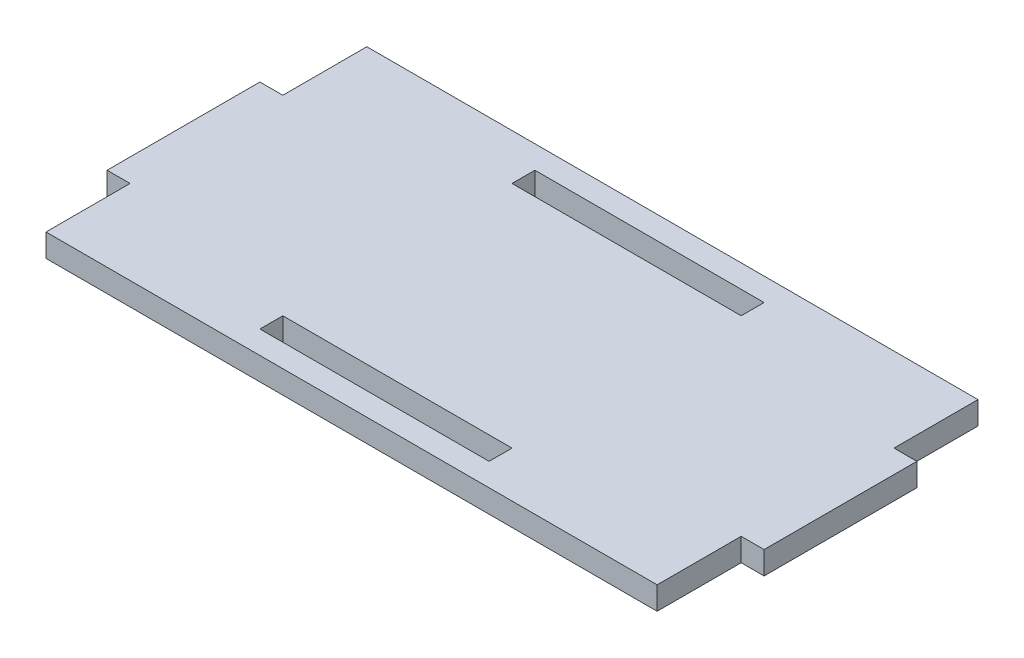
ISO-10303-21;
HEADER;
FILE_DESCRIPTION(('STEP AP214'),'2;1');
FILE_NAME('part.step','',(''),(''),'','','');
FILE_SCHEMA(('AUTOMOTIVE_DESIGN { 1 0 10303 214 1 1 1 1 }'));
ENDSEC;
DATA;
#1=APPLICATION_CONTEXT('core data for automotive mechanical design processes');
#2=APPLICATION_PROTOCOL_DEFINITION('international standard','automotive_design',2000,#1);
#3=PRODUCT_CONTEXT('',#1,'mechanical');
#4=PRODUCT('Part','Part','',(#3));
#5=PRODUCT_RELATED_PRODUCT_CATEGORY('part','',(#4));
#6=PRODUCT_DEFINITION_FORMATION('','',#4);
#7=PRODUCT_DEFINITION_CONTEXT('part definition',#1,'design');
#8=PRODUCT_DEFINITION('design','',#6,#7);
#9=PRODUCT_DEFINITION_SHAPE('','',#8);
#10=(LENGTH_UNIT() NAMED_UNIT(*) SI_UNIT(.MILLI.,.METRE.));
#11=(NAMED_UNIT(*) PLANE_ANGLE_UNIT() SI_UNIT($,.RADIAN.));
#12=(NAMED_UNIT(*) SI_UNIT($,.STERADIAN.) SOLID_ANGLE_UNIT());
#13=UNCERTAINTY_MEASURE_WITH_UNIT(LENGTH_MEASURE(1.E-05),#10,'distance_accuracy_value','');
#14=(GEOMETRIC_REPRESENTATION_CONTEXT(3) GLOBAL_UNCERTAINTY_ASSIGNED_CONTEXT((#13)) GLOBAL_UNIT_ASSIGNED_CONTEXT((#10,
#11,#12)) REPRESENTATION_CONTEXT('',''));
#15=CARTESIAN_POINT('',(0.,0.,0.));
#16=DIRECTION('',(0.,0.,1.));
#17=DIRECTION('',(1.,0.,0.));
#18=AXIS2_PLACEMENT_3D('',#15,#16,#17);
#19=CARTESIAN_POINT('',(0.,3.,0.));
#20=DIRECTION('',(0.,1.,0.));
#21=DIRECTION('',(0.,0.,1.));
#22=AXIS2_PLACEMENT_3D('',#19,#20,#21);
#23=PLANE('',#22);
#24=DIRECTION('',(0.,0.,1.));
#25=VECTOR('',#24,1.);
#26=CARTESIAN_POINT('',(0.,3.,0.));
#27=LINE('',#26,#25);
#28=CARTESIAN_POINT('',(0.,3.,-11.));
#29=VERTEX_POINT('',#28);
#30=CARTESIAN_POINT('',(0.,3.,0.));
#31=VERTEX_POINT('',#30);
#32=EDGE_CURVE('E237',#29,#31,#27,.T.);
#33=ORIENTED_EDGE('',*,*,#32,.T.);
#34=DIRECTION('',(1.,0.,0.));
#35=VECTOR('',#34,1.);
#36=CARTESIAN_POINT('',(0.,3.,0.));
#37=LINE('',#36,#35);
#38=CARTESIAN_POINT('',(80.,3.,0.));
#39=VERTEX_POINT('',#38);
#40=EDGE_CURVE('E240',#31,#39,#37,.T.);
#41=ORIENTED_EDGE('',*,*,#40,.T.);
#42=DIRECTION('',(0.,0.,-1.));
#43=VECTOR('',#42,1.);
#44=CARTESIAN_POINT('',(80.,3.,0.));
#45=LINE('',#44,#43);
#46=CARTESIAN_POINT('',(80.,3.,-11.));
#47=VERTEX_POINT('',#46);
#48=EDGE_CURVE('E243',#39,#47,#45,.T.);
#49=ORIENTED_EDGE('',*,*,#48,.T.);
#50=DIRECTION('',(1.,0.,0.));
#51=VECTOR('',#50,1.);
#52=CARTESIAN_POINT('',(80.,3.,-11.));
#53=LINE('',#52,#51);
#54=CARTESIAN_POINT('',(83.,3.,-11.));
#55=VERTEX_POINT('',#54);
#56=EDGE_CURVE('E245',#47,#55,#53,.T.);
#57=ORIENTED_EDGE('',*,*,#56,.T.);
#58=DIRECTION('',(0.,0.,-1.));
#59=VECTOR('',#58,1.);
#60=CARTESIAN_POINT('',(83.,3.,-31.));
#61=LINE('',#60,#59);
#62=CARTESIAN_POINT('',(83.,3.,-31.));
#63=VERTEX_POINT('',#62);
#64=EDGE_CURVE('E247',#55,#63,#61,.T.);
#65=ORIENTED_EDGE('',*,*,#64,.T.);
#66=DIRECTION('',(-1.,0.,0.));
#67=VECTOR('',#66,1.);
#68=CARTESIAN_POINT('',(80.,3.,-31.));
#69=LINE('',#68,#67);
#70=CARTESIAN_POINT('',(80.,3.,-31.));
#71=VERTEX_POINT('',#70);
#72=EDGE_CURVE('E249',#63,#71,#69,.T.);
#73=ORIENTED_EDGE('',*,*,#72,.T.);
#74=DIRECTION('',(0.,0.,-1.));
#75=VECTOR('',#74,1.);
#76=CARTESIAN_POINT('',(80.,3.,-31.));
#77=LINE('',#76,#75);
#78=CARTESIAN_POINT('',(80.,3.,-42.));
#79=VERTEX_POINT('',#78);
#80=EDGE_CURVE('E251',#71,#79,#77,.T.);
#81=ORIENTED_EDGE('',*,*,#80,.T.);
#82=DIRECTION('',(-1.,0.,0.));
#83=VECTOR('',#82,1.);
#84=CARTESIAN_POINT('',(0.,3.,-42.));
#85=LINE('',#84,#83);
#86=CARTESIAN_POINT('',(0.,3.,-42.));
#87=VERTEX_POINT('',#86);
#88=EDGE_CURVE('E253',#79,#87,#85,.T.);
#89=ORIENTED_EDGE('',*,*,#88,.T.);
#90=DIRECTION('',(0.,0.,1.));
#91=VECTOR('',#90,1.);
#92=CARTESIAN_POINT('',(0.,3.,-31.));
#93=LINE('',#92,#91);
#94=CARTESIAN_POINT('',(0.,3.,-31.));
#95=VERTEX_POINT('',#94);
#96=EDGE_CURVE('E255',#87,#95,#93,.T.);
#97=ORIENTED_EDGE('',*,*,#96,.T.);
#98=DIRECTION('',(-1.,0.,0.));
#99=VECTOR('',#98,1.);
#100=CARTESIAN_POINT('',(0.,3.,-31.));
#101=LINE('',#100,#99);
#102=CARTESIAN_POINT('',(-3.,3.,-31.));
#103=VERTEX_POINT('',#102);
#104=EDGE_CURVE('E257',#95,#103,#101,.T.);
#105=ORIENTED_EDGE('',*,*,#104,.T.);
#106=DIRECTION('',(0.,0.,1.));
#107=VECTOR('',#106,1.);
#108=CARTESIAN_POINT('',(-3.,3.,-31.));
#109=LINE('',#108,#107);
#110=CARTESIAN_POINT('',(-3.,3.,-11.));
#111=VERTEX_POINT('',#110);
#112=EDGE_CURVE('E259',#103,#111,#109,.T.);
#113=ORIENTED_EDGE('',*,*,#112,.T.);
#114=DIRECTION('',(1.,0.,0.));
#115=VECTOR('',#114,1.);
#116=CARTESIAN_POINT('',(0.,3.,-11.));
#117=LINE('',#116,#115);
#118=EDGE_CURVE('E261',#111,#29,#117,.T.);
#119=ORIENTED_EDGE('',*,*,#118,.T.);
#120=EDGE_LOOP('',(#33,#41,#49,#57,#65,#73,#81,#89,#97,#105,#113,#119));
#121=FACE_BOUND('',#120,.T.);
#122=DIRECTION('',(1.,0.,0.));
#123=VECTOR('',#122,1.);
#124=CARTESIAN_POINT('',(25.,3.,-36.));
#125=LINE('',#124,#123);
#126=CARTESIAN_POINT('',(25.,3.,-36.));
#127=VERTEX_POINT('',#126);
#128=CARTESIAN_POINT('',(55.,3.,-36.));
#129=VERTEX_POINT('',#128);
#130=EDGE_CURVE('E208',#127,#129,#125,.T.);
#131=ORIENTED_EDGE('',*,*,#130,.F.);
#132=DIRECTION('',(0.,0.,1.));
#133=VECTOR('',#132,1.);
#134=CARTESIAN_POINT('',(25.,3.,-39.));
#135=LINE('',#134,#133);
#136=CARTESIAN_POINT('',(25.,3.,-39.));
#137=VERTEX_POINT('',#136);
#138=EDGE_CURVE('E206',#137,#127,#135,.T.);
#139=ORIENTED_EDGE('',*,*,#138,.F.);
#140=DIRECTION('',(-1.,0.,0.));
#141=VECTOR('',#140,1.);
#142=CARTESIAN_POINT('',(25.,3.,-39.));
#143=LINE('',#142,#141);
#144=CARTESIAN_POINT('',(55.,3.,-39.));
#145=VERTEX_POINT('',#144);
#146=EDGE_CURVE('E214',#145,#137,#143,.T.);
#147=ORIENTED_EDGE('',*,*,#146,.F.);
#148=DIRECTION('',(0.,0.,-1.));
#149=VECTOR('',#148,1.);
#150=CARTESIAN_POINT('',(55.,3.,-39.));
#151=LINE('',#150,#149);
#152=EDGE_CURVE('E211',#129,#145,#151,.T.);
#153=ORIENTED_EDGE('',*,*,#152,.F.);
#154=EDGE_LOOP('',(#131,#139,#147,#153));
#155=FACE_BOUND('',#154,.T.);
#156=DIRECTION('',(1.,0.,0.));
#157=VECTOR('',#156,1.);
#158=CARTESIAN_POINT('',(25.,3.,-3.));
#159=LINE('',#158,#157);
#160=CARTESIAN_POINT('',(25.,3.,-3.));
#161=VERTEX_POINT('',#160);
#162=CARTESIAN_POINT('',(55.,3.,-3.));
#163=VERTEX_POINT('',#162);
#164=EDGE_CURVE('E178',#161,#163,#159,.T.);
#165=ORIENTED_EDGE('',*,*,#164,.F.);
#166=DIRECTION('',(0.,0.,1.));
#167=VECTOR('',#166,1.);
#168=CARTESIAN_POINT('',(25.,3.,-3.));
#169=LINE('',#168,#167);
#170=CARTESIAN_POINT('',(25.,3.,-6.));
#171=VERTEX_POINT('',#170);
#172=EDGE_CURVE('E170',#171,#161,#169,.T.);
#173=ORIENTED_EDGE('',*,*,#172,.F.);
#174=DIRECTION('',(-1.,0.,0.));
#175=VECTOR('',#174,1.);
#176=CARTESIAN_POINT('',(25.,3.,-6.));
#177=LINE('',#176,#175);
#178=CARTESIAN_POINT('',(55.,3.,-6.));
#179=VERTEX_POINT('',#178);
#180=EDGE_CURVE('E192',#179,#171,#177,.T.);
#181=ORIENTED_EDGE('',*,*,#180,.F.);
#182=DIRECTION('',(0.,0.,-1.));
#183=VECTOR('',#182,1.);
#184=CARTESIAN_POINT('',(55.,3.,-3.));
#185=LINE('',#184,#183);
#186=EDGE_CURVE('E190',#163,#179,#185,.T.);
#187=ORIENTED_EDGE('',*,*,#186,.F.);
#188=EDGE_LOOP('',(#165,#173,#181,#187));
#189=FACE_BOUND('',#188,.T.);
#190=ADVANCED_FACE('F33',(#121,#155,#189),#23,.T.);
#191=CARTESIAN_POINT('',(0.,0.,0.));
#192=DIRECTION('',(0.,1.,0.));
#193=DIRECTION('',(0.,0.,1.));
#194=AXIS2_PLACEMENT_3D('',#191,#192,#193);
#195=PLANE('',#194);
#196=DIRECTION('',(0.,0.,1.));
#197=VECTOR('',#196,1.);
#198=CARTESIAN_POINT('',(25.,0.,-39.));
#199=LINE('',#198,#197);
#200=CARTESIAN_POINT('',(25.,0.,-39.));
#201=VERTEX_POINT('',#200);
#202=CARTESIAN_POINT('',(25.,0.,-36.));
#203=VERTEX_POINT('',#202);
#204=EDGE_CURVE('E186',#201,#203,#199,.T.);
#205=ORIENTED_EDGE('',*,*,#204,.T.);
#206=DIRECTION('',(1.,0.,0.));
#207=VECTOR('',#206,1.);
#208=CARTESIAN_POINT('',(25.,0.,-36.));
#209=LINE('',#208,#207);
#210=CARTESIAN_POINT('',(55.,0.,-36.));
#211=VERTEX_POINT('',#210);
#212=EDGE_CURVE('E219',#203,#211,#209,.T.);
#213=ORIENTED_EDGE('',*,*,#212,.T.);
#214=DIRECTION('',(0.,0.,-1.));
#215=VECTOR('',#214,1.);
#216=CARTESIAN_POINT('',(55.,0.,-39.));
#217=LINE('',#216,#215);
#218=CARTESIAN_POINT('',(55.,0.,-39.));
#219=VERTEX_POINT('',#218);
#220=EDGE_CURVE('E222',#211,#219,#217,.T.);
#221=ORIENTED_EDGE('',*,*,#220,.T.);
#222=DIRECTION('',(-1.,0.,0.));
#223=VECTOR('',#222,1.);
#224=CARTESIAN_POINT('',(25.,0.,-39.));
#225=LINE('',#224,#223);
#226=EDGE_CURVE('E209',#219,#201,#225,.T.);
#227=ORIENTED_EDGE('',*,*,#226,.T.);
#228=EDGE_LOOP('',(#205,#213,#221,#227));
#229=FACE_BOUND('',#228,.T.);
#230=DIRECTION('',(0.,0.,1.));
#231=VECTOR('',#230,1.);
#232=CARTESIAN_POINT('',(0.,0.,0.));
#233=LINE('',#232,#231);
#234=CARTESIAN_POINT('',(0.,0.,-11.));
#235=VERTEX_POINT('',#234);
#236=CARTESIAN_POINT('',(0.,0.,0.));
#237=VERTEX_POINT('',#236);
#238=EDGE_CURVE('E236',#235,#237,#233,.T.);
#239=ORIENTED_EDGE('',*,*,#238,.F.);
#240=DIRECTION('',(1.,0.,0.));
#241=VECTOR('',#240,1.);
#242=CARTESIAN_POINT('',(0.,0.,-11.));
#243=LINE('',#242,#241);
#244=CARTESIAN_POINT('',(-3.,0.,-11.));
#245=VERTEX_POINT('',#244);
#246=EDGE_CURVE('E241',#245,#235,#243,.T.);
#247=ORIENTED_EDGE('',*,*,#246,.F.);
#248=DIRECTION('',(0.,0.,1.));
#249=VECTOR('',#248,1.);
#250=CARTESIAN_POINT('',(-3.,0.,-31.));
#251=LINE('',#250,#249);
#252=CARTESIAN_POINT('',(-3.,0.,-31.));
#253=VERTEX_POINT('',#252);
#254=EDGE_CURVE('E284',#253,#245,#251,.T.);
#255=ORIENTED_EDGE('',*,*,#254,.F.);
#256=DIRECTION('',(-1.,0.,0.));
#257=VECTOR('',#256,1.);
#258=CARTESIAN_POINT('',(0.,0.,-31.));
#259=LINE('',#258,#257);
#260=CARTESIAN_POINT('',(0.,0.,-31.));
#261=VERTEX_POINT('',#260);
#262=EDGE_CURVE('E282',#261,#253,#259,.T.);
#263=ORIENTED_EDGE('',*,*,#262,.F.);
#264=DIRECTION('',(0.,0.,1.));
#265=VECTOR('',#264,1.);
#266=CARTESIAN_POINT('',(0.,0.,-31.));
#267=LINE('',#266,#265);
#268=CARTESIAN_POINT('',(0.,0.,-42.));
#269=VERTEX_POINT('',#268);
#270=EDGE_CURVE('E280',#269,#261,#267,.T.);
#271=ORIENTED_EDGE('',*,*,#270,.F.);
#272=DIRECTION('',(-1.,0.,0.));
#273=VECTOR('',#272,1.);
#274=CARTESIAN_POINT('',(0.,0.,-42.));
#275=LINE('',#274,#273);
#276=CARTESIAN_POINT('',(80.,0.,-42.));
#277=VERTEX_POINT('',#276);
#278=EDGE_CURVE('E278',#277,#269,#275,.T.);
#279=ORIENTED_EDGE('',*,*,#278,.F.);
#280=DIRECTION('',(0.,0.,-1.));
#281=VECTOR('',#280,1.);
#282=CARTESIAN_POINT('',(80.,0.,-31.));
#283=LINE('',#282,#281);
#284=CARTESIAN_POINT('',(80.,0.,-31.));
#285=VERTEX_POINT('',#284);
#286=EDGE_CURVE('E276',#285,#277,#283,.T.);
#287=ORIENTED_EDGE('',*,*,#286,.F.);
#288=DIRECTION('',(-1.,0.,0.));
#289=VECTOR('',#288,1.);
#290=CARTESIAN_POINT('',(80.,0.,-31.));
#291=LINE('',#290,#289);
#292=CARTESIAN_POINT('',(83.,0.,-31.));
#293=VERTEX_POINT('',#292);
#294=EDGE_CURVE('E274',#293,#285,#291,.T.);
#295=ORIENTED_EDGE('',*,*,#294,.F.);
#296=DIRECTION('',(0.,0.,-1.));
#297=VECTOR('',#296,1.);
#298=CARTESIAN_POINT('',(83.,0.,-31.));
#299=LINE('',#298,#297);
#300=CARTESIAN_POINT('',(83.,0.,-11.));
#301=VERTEX_POINT('',#300);
#302=EDGE_CURVE('E272',#301,#293,#299,.T.);
#303=ORIENTED_EDGE('',*,*,#302,.F.);
#304=DIRECTION('',(1.,0.,0.));
#305=VECTOR('',#304,1.);
#306=CARTESIAN_POINT('',(80.,0.,-11.));
#307=LINE('',#306,#305);
#308=CARTESIAN_POINT('',(80.,0.,-11.));
#309=VERTEX_POINT('',#308);
#310=EDGE_CURVE('E270',#309,#301,#307,.T.);
#311=ORIENTED_EDGE('',*,*,#310,.F.);
#312=DIRECTION('',(0.,0.,-1.));
#313=VECTOR('',#312,1.);
#314=CARTESIAN_POINT('',(80.,0.,0.));
#315=LINE('',#314,#313);
#316=CARTESIAN_POINT('',(80.,0.,0.));
#317=VERTEX_POINT('',#316);
#318=EDGE_CURVE('E268',#317,#309,#315,.T.);
#319=ORIENTED_EDGE('',*,*,#318,.F.);
#320=DIRECTION('',(1.,0.,0.));
#321=VECTOR('',#320,1.);
#322=CARTESIAN_POINT('',(0.,0.,0.));
#323=LINE('',#322,#321);
#324=EDGE_CURVE('E266',#237,#317,#323,.T.);
#325=ORIENTED_EDGE('',*,*,#324,.F.);
#326=EDGE_LOOP('',(#239,#247,#255,#263,#271,#279,#287,#295,#303,#311,#319,#325));
#327=FACE_BOUND('',#326,.T.);
#328=DIRECTION('',(0.,0.,1.));
#329=VECTOR('',#328,1.);
#330=CARTESIAN_POINT('',(25.,0.,-3.));
#331=LINE('',#330,#329);
#332=CARTESIAN_POINT('',(25.,0.,-6.));
#333=VERTEX_POINT('',#332);
#334=CARTESIAN_POINT('',(25.,0.,-3.));
#335=VERTEX_POINT('',#334);
#336=EDGE_CURVE('E56',#333,#335,#331,.T.);
#337=ORIENTED_EDGE('',*,*,#336,.T.);
#338=DIRECTION('',(1.,0.,0.));
#339=VECTOR('',#338,1.);
#340=CARTESIAN_POINT('',(25.,0.,-3.));
#341=LINE('',#340,#339);
#342=CARTESIAN_POINT('',(55.,0.,-3.));
#343=VERTEX_POINT('',#342);
#344=EDGE_CURVE('E185',#335,#343,#341,.T.);
#345=ORIENTED_EDGE('',*,*,#344,.T.);
#346=DIRECTION('',(0.,0.,-1.));
#347=VECTOR('',#346,1.);
#348=CARTESIAN_POINT('',(55.,0.,-3.));
#349=LINE('',#348,#347);
#350=CARTESIAN_POINT('',(55.,0.,-6.));
#351=VERTEX_POINT('',#350);
#352=EDGE_CURVE('E198',#343,#351,#349,.T.);
#353=ORIENTED_EDGE('',*,*,#352,.T.);
#354=DIRECTION('',(-1.,0.,0.));
#355=VECTOR('',#354,1.);
#356=CARTESIAN_POINT('',(25.,0.,-6.));
#357=LINE('',#356,#355);
#358=EDGE_CURVE('E179',#351,#333,#357,.T.);
#359=ORIENTED_EDGE('',*,*,#358,.T.);
#360=EDGE_LOOP('',(#337,#345,#353,#359));
#361=FACE_BOUND('',#360,.T.);
#362=ADVANCED_FACE('F326',(#229,#327,#361),#195,.F.);
#363=CARTESIAN_POINT('',(0.,3.,0.));
#364=DIRECTION('',(1.,0.,0.));
#365=DIRECTION('',(0.,0.,-1.));
#366=AXIS2_PLACEMENT_3D('',#363,#364,#365);
#367=PLANE('',#366);
#368=ORIENTED_EDGE('',*,*,#238,.T.);
#369=DIRECTION('',(0.,-1.,0.));
#370=VECTOR('',#369,1.);
#371=CARTESIAN_POINT('',(0.,3.,0.));
#372=LINE('',#371,#370);
#373=EDGE_CURVE('E11',#31,#237,#372,.T.);
#374=ORIENTED_EDGE('',*,*,#373,.F.);
#375=ORIENTED_EDGE('',*,*,#32,.F.);
#376=DIRECTION('',(0.,-1.,0.));
#377=VECTOR('',#376,1.);
#378=CARTESIAN_POINT('',(0.,3.,-11.));
#379=LINE('',#378,#377);
#380=EDGE_CURVE('E263',#29,#235,#379,.T.);
#381=ORIENTED_EDGE('',*,*,#380,.T.);
#382=EDGE_LOOP('',(#368,#374,#375,#381));
#383=FACE_BOUND('',#382,.T.);
#384=ADVANCED_FACE('F35',(#383),#367,.F.);
#385=CARTESIAN_POINT('',(0.,3.,0.));
#386=DIRECTION('',(0.,0.,-1.));
#387=DIRECTION('',(-1.,0.,0.));
#388=AXIS2_PLACEMENT_3D('',#385,#386,#387);
#389=PLANE('',#388);
#390=ORIENTED_EDGE('',*,*,#324,.T.);
#391=DIRECTION('',(0.,-1.,0.));
#392=VECTOR('',#391,1.);
#393=CARTESIAN_POINT('',(80.,3.,0.));
#394=LINE('',#393,#392);
#395=EDGE_CURVE('E41',#39,#317,#394,.T.);
#396=ORIENTED_EDGE('',*,*,#395,.F.);
#397=ORIENTED_EDGE('',*,*,#40,.F.);
#398=ORIENTED_EDGE('',*,*,#373,.T.);
#399=EDGE_LOOP('',(#390,#396,#397,#398));
#400=FACE_BOUND('',#399,.T.);
#401=ADVANCED_FACE('F344',(#400),#389,.F.);
#402=CARTESIAN_POINT('',(80.,3.,0.));
#403=DIRECTION('',(-1.,0.,0.));
#404=DIRECTION('',(0.,0.,1.));
#405=AXIS2_PLACEMENT_3D('',#402,#403,#404);
#406=PLANE('',#405);
#407=ORIENTED_EDGE('',*,*,#318,.T.);
#408=DIRECTION('',(0.,-1.,0.));
#409=VECTOR('',#408,1.);
#410=CARTESIAN_POINT('',(80.,3.,-11.));
#411=LINE('',#410,#409);
#412=EDGE_CURVE('E313',#47,#309,#411,.T.);
#413=ORIENTED_EDGE('',*,*,#412,.F.);
#414=ORIENTED_EDGE('',*,*,#48,.F.);
#415=ORIENTED_EDGE('',*,*,#395,.T.);
#416=EDGE_LOOP('',(#407,#413,#414,#415));
#417=FACE_BOUND('',#416,.T.);
#418=ADVANCED_FACE('F320',(#417),#406,.F.);
#419=CARTESIAN_POINT('',(80.,3.,-11.));
#420=DIRECTION('',(0.,0.,-1.));
#421=DIRECTION('',(-1.,0.,0.));
#422=AXIS2_PLACEMENT_3D('',#419,#420,#421);
#423=PLANE('',#422);
#424=ORIENTED_EDGE('',*,*,#310,.T.);
#425=DIRECTION('',(0.,-1.,0.));
#426=VECTOR('',#425,1.);
#427=CARTESIAN_POINT('',(83.,3.,-11.));
#428=LINE('',#427,#426);
#429=EDGE_CURVE('E310',#55,#301,#428,.T.);
#430=ORIENTED_EDGE('',*,*,#429,.F.);
#431=ORIENTED_EDGE('',*,*,#56,.F.);
#432=ORIENTED_EDGE('',*,*,#412,.T.);
#433=EDGE_LOOP('',(#424,#430,#431,#432));
#434=FACE_BOUND('',#433,.T.);
#435=ADVANCED_FACE('F332',(#434),#423,.F.);
#436=CARTESIAN_POINT('',(83.,3.,-31.));
#437=DIRECTION('',(-1.,0.,0.));
#438=DIRECTION('',(0.,0.,1.));
#439=AXIS2_PLACEMENT_3D('',#436,#437,#438);
#440=PLANE('',#439);
#441=ORIENTED_EDGE('',*,*,#302,.T.);
#442=DIRECTION('',(0.,-1.,0.));
#443=VECTOR('',#442,1.);
#444=CARTESIAN_POINT('',(83.,3.,-31.));
#445=LINE('',#444,#443);
#446=EDGE_CURVE('E307',#63,#293,#445,.T.);
#447=ORIENTED_EDGE('',*,*,#446,.F.);
#448=ORIENTED_EDGE('',*,*,#64,.F.);
#449=ORIENTED_EDGE('',*,*,#429,.T.);
#450=EDGE_LOOP('',(#441,#447,#448,#449));
#451=FACE_BOUND('',#450,.T.);
#452=ADVANCED_FACE('F336',(#451),#440,.F.);
#453=CARTESIAN_POINT('',(80.,3.,-31.));
#454=DIRECTION('',(0.,0.,1.));
#455=DIRECTION('',(1.,0.,0.));
#456=AXIS2_PLACEMENT_3D('',#453,#454,#455);
#457=PLANE('',#456);
#458=ORIENTED_EDGE('',*,*,#294,.T.);
#459=DIRECTION('',(0.,-1.,0.));
#460=VECTOR('',#459,1.);
#461=CARTESIAN_POINT('',(80.,3.,-31.));
#462=LINE('',#461,#460);
#463=EDGE_CURVE('E304',#71,#285,#462,.T.);
#464=ORIENTED_EDGE('',*,*,#463,.F.);
#465=ORIENTED_EDGE('',*,*,#72,.F.);
#466=ORIENTED_EDGE('',*,*,#446,.T.);
#467=EDGE_LOOP('',(#458,#464,#465,#466));
#468=FACE_BOUND('',#467,.T.);
#469=ADVANCED_FACE('F377',(#468),#457,.F.);
#470=CARTESIAN_POINT('',(80.,3.,-31.));
#471=DIRECTION('',(-1.,0.,0.));
#472=DIRECTION('',(0.,0.,1.));
#473=AXIS2_PLACEMENT_3D('',#470,#471,#472);
#474=PLANE('',#473);
#475=ORIENTED_EDGE('',*,*,#286,.T.);
#476=DIRECTION('',(0.,-1.,0.));
#477=VECTOR('',#476,1.);
#478=CARTESIAN_POINT('',(80.,3.,-42.));
#479=LINE('',#478,#477);
#480=EDGE_CURVE('E301',#79,#277,#479,.T.);
#481=ORIENTED_EDGE('',*,*,#480,.F.);
#482=ORIENTED_EDGE('',*,*,#80,.F.);
#483=ORIENTED_EDGE('',*,*,#463,.T.);
#484=EDGE_LOOP('',(#475,#481,#482,#483));
#485=FACE_BOUND('',#484,.T.);
#486=ADVANCED_FACE('F375',(#485),#474,.F.);
#487=CARTESIAN_POINT('',(0.,3.,-42.));
#488=DIRECTION('',(0.,0.,1.));
#489=DIRECTION('',(1.,0.,0.));
#490=AXIS2_PLACEMENT_3D('',#487,#488,#489);
#491=PLANE('',#490);
#492=ORIENTED_EDGE('',*,*,#278,.T.);
#493=DIRECTION('',(0.,-1.,0.));
#494=VECTOR('',#493,1.);
#495=CARTESIAN_POINT('',(0.,3.,-42.));
#496=LINE('',#495,#494);
#497=EDGE_CURVE('E298',#87,#269,#496,.T.);
#498=ORIENTED_EDGE('',*,*,#497,.F.);
#499=ORIENTED_EDGE('',*,*,#88,.F.);
#500=ORIENTED_EDGE('',*,*,#480,.T.);
#501=EDGE_LOOP('',(#492,#498,#499,#500));
#502=FACE_BOUND('',#501,.T.);
#503=ADVANCED_FACE('F371',(#502),#491,.F.);
#504=CARTESIAN_POINT('',(0.,3.,-31.));
#505=DIRECTION('',(1.,0.,0.));
#506=DIRECTION('',(0.,0.,-1.));
#507=AXIS2_PLACEMENT_3D('',#504,#505,#506);
#508=PLANE('',#507);
#509=ORIENTED_EDGE('',*,*,#270,.T.);
#510=DIRECTION('',(0.,-1.,0.));
#511=VECTOR('',#510,1.);
#512=CARTESIAN_POINT('',(0.,3.,-31.));
#513=LINE('',#512,#511);
#514=EDGE_CURVE('E295',#95,#261,#513,.T.);
#515=ORIENTED_EDGE('',*,*,#514,.F.);
#516=ORIENTED_EDGE('',*,*,#96,.F.);
#517=ORIENTED_EDGE('',*,*,#497,.T.);
#518=EDGE_LOOP('',(#509,#515,#516,#517));
#519=FACE_BOUND('',#518,.T.);
#520=ADVANCED_FACE('F366',(#519),#508,.F.);
#521=CARTESIAN_POINT('',(0.,3.,-31.));
#522=DIRECTION('',(0.,0.,1.));
#523=DIRECTION('',(1.,0.,0.));
#524=AXIS2_PLACEMENT_3D('',#521,#522,#523);
#525=PLANE('',#524);
#526=ORIENTED_EDGE('',*,*,#262,.T.);
#527=DIRECTION('',(0.,-1.,0.));
#528=VECTOR('',#527,1.);
#529=CARTESIAN_POINT('',(-3.,3.,-31.));
#530=LINE('',#529,#528);
#531=EDGE_CURVE('E292',#103,#253,#530,.T.);
#532=ORIENTED_EDGE('',*,*,#531,.F.);
#533=ORIENTED_EDGE('',*,*,#104,.F.);
#534=ORIENTED_EDGE('',*,*,#514,.T.);
#535=EDGE_LOOP('',(#526,#532,#533,#534));
#536=FACE_BOUND('',#535,.T.);
#537=ADVANCED_FACE('F360',(#536),#525,.F.);
#538=CARTESIAN_POINT('',(-3.,3.,-31.));
#539=DIRECTION('',(1.,0.,0.));
#540=DIRECTION('',(0.,0.,-1.));
#541=AXIS2_PLACEMENT_3D('',#538,#539,#540);
#542=PLANE('',#541);
#543=ORIENTED_EDGE('',*,*,#254,.T.);
#544=DIRECTION('',(0.,-1.,0.));
#545=VECTOR('',#544,1.);
#546=CARTESIAN_POINT('',(-3.,3.,-11.));
#547=LINE('',#546,#545);
#548=EDGE_CURVE('E289',#111,#245,#547,.T.);
#549=ORIENTED_EDGE('',*,*,#548,.F.);
#550=ORIENTED_EDGE('',*,*,#112,.F.);
#551=ORIENTED_EDGE('',*,*,#531,.T.);
#552=EDGE_LOOP('',(#543,#549,#550,#551));
#553=FACE_BOUND('',#552,.T.);
#554=ADVANCED_FACE('F356',(#553),#542,.F.);
#555=CARTESIAN_POINT('',(0.,3.,-11.));
#556=DIRECTION('',(0.,0.,-1.));
#557=DIRECTION('',(-1.,0.,0.));
#558=AXIS2_PLACEMENT_3D('',#555,#556,#557);
#559=PLANE('',#558);
#560=ORIENTED_EDGE('',*,*,#246,.T.);
#561=ORIENTED_EDGE('',*,*,#380,.F.);
#562=ORIENTED_EDGE('',*,*,#118,.F.);
#563=ORIENTED_EDGE('',*,*,#548,.T.);
#564=EDGE_LOOP('',(#560,#561,#562,#563));
#565=FACE_BOUND('',#564,.T.);
#566=ADVANCED_FACE('F351',(#565),#559,.F.);
#567=CARTESIAN_POINT('',(25.,3.,-39.));
#568=DIRECTION('',(1.,0.,0.));
#569=DIRECTION('',(0.,0.,-1.));
#570=AXIS2_PLACEMENT_3D('',#567,#568,#569);
#571=PLANE('',#570);
#572=ORIENTED_EDGE('',*,*,#204,.F.);
#573=DIRECTION('',(0.,-1.,0.));
#574=VECTOR('',#573,1.);
#575=CARTESIAN_POINT('',(25.,3.,-39.));
#576=LINE('',#575,#574);
#577=EDGE_CURVE('E216',#137,#201,#576,.T.);
#578=ORIENTED_EDGE('',*,*,#577,.F.);
#579=ORIENTED_EDGE('',*,*,#138,.T.);
#580=DIRECTION('',(0.,-1.,0.));
#581=VECTOR('',#580,1.);
#582=CARTESIAN_POINT('',(25.,3.,-36.));
#583=LINE('',#582,#581);
#584=EDGE_CURVE('E233',#127,#203,#583,.T.);
#585=ORIENTED_EDGE('',*,*,#584,.T.);
#586=EDGE_LOOP('',(#572,#578,#579,#585));
#587=FACE_BOUND('',#586,.T.);
#588=ADVANCED_FACE('F394',(#587),#571,.T.);
#589=CARTESIAN_POINT('',(25.,3.,-36.));
#590=DIRECTION('',(0.,0.,-1.));
#591=DIRECTION('',(-1.,0.,0.));
#592=AXIS2_PLACEMENT_3D('',#589,#590,#591);
#593=PLANE('',#592);
#594=ORIENTED_EDGE('',*,*,#212,.F.);
#595=ORIENTED_EDGE('',*,*,#584,.F.);
#596=ORIENTED_EDGE('',*,*,#130,.T.);
#597=DIRECTION('',(0.,-1.,0.));
#598=VECTOR('',#597,1.);
#599=CARTESIAN_POINT('',(55.,3.,-36.));
#600=LINE('',#599,#598);
#601=EDGE_CURVE('E231',#129,#211,#600,.T.);
#602=ORIENTED_EDGE('',*,*,#601,.T.);
#603=EDGE_LOOP('',(#594,#595,#596,#602));
#604=FACE_BOUND('',#603,.T.);
#605=ADVANCED_FACE('F432',(#604),#593,.T.);
#606=CARTESIAN_POINT('',(55.,3.,-39.));
#607=DIRECTION('',(-1.,0.,0.));
#608=DIRECTION('',(0.,0.,1.));
#609=AXIS2_PLACEMENT_3D('',#606,#607,#608);
#610=PLANE('',#609);
#611=ORIENTED_EDGE('',*,*,#220,.F.);
#612=ORIENTED_EDGE('',*,*,#601,.F.);
#613=ORIENTED_EDGE('',*,*,#152,.T.);
#614=DIRECTION('',(0.,-1.,0.));
#615=VECTOR('',#614,1.);
#616=CARTESIAN_POINT('',(55.,3.,-39.));
#617=LINE('',#616,#615);
#618=EDGE_CURVE('E229',#145,#219,#617,.T.);
#619=ORIENTED_EDGE('',*,*,#618,.T.);
#620=EDGE_LOOP('',(#611,#612,#613,#619));
#621=FACE_BOUND('',#620,.T.);
#622=ADVANCED_FACE('F439',(#621),#610,.T.);
#623=CARTESIAN_POINT('',(25.,3.,-39.));
#624=DIRECTION('',(0.,0.,1.));
#625=DIRECTION('',(1.,0.,0.));
#626=AXIS2_PLACEMENT_3D('',#623,#624,#625);
#627=PLANE('',#626);
#628=ORIENTED_EDGE('',*,*,#226,.F.);
#629=ORIENTED_EDGE('',*,*,#618,.F.);
#630=ORIENTED_EDGE('',*,*,#146,.T.);
#631=ORIENTED_EDGE('',*,*,#577,.T.);
#632=EDGE_LOOP('',(#628,#629,#630,#631));
#633=FACE_BOUND('',#632,.T.);
#634=ADVANCED_FACE('F446',(#633),#627,.T.);
#635=CARTESIAN_POINT('',(25.,3.,-3.));
#636=DIRECTION('',(1.,0.,0.));
#637=DIRECTION('',(0.,0.,-1.));
#638=AXIS2_PLACEMENT_3D('',#635,#636,#637);
#639=PLANE('',#638);
#640=ORIENTED_EDGE('',*,*,#336,.F.);
#641=DIRECTION('',(0.,-1.,0.));
#642=VECTOR('',#641,1.);
#643=CARTESIAN_POINT('',(25.,3.,-6.));
#644=LINE('',#643,#642);
#645=EDGE_CURVE('E174',#171,#333,#644,.T.);
#646=ORIENTED_EDGE('',*,*,#645,.F.);
#647=ORIENTED_EDGE('',*,*,#172,.T.);
#648=DIRECTION('',(0.,-1.,0.));
#649=VECTOR('',#648,1.);
#650=CARTESIAN_POINT('',(25.,3.,-3.));
#651=LINE('',#650,#649);
#652=EDGE_CURVE('E173',#161,#335,#651,.T.);
#653=ORIENTED_EDGE('',*,*,#652,.T.);
#654=EDGE_LOOP('',(#640,#646,#647,#653));
#655=FACE_BOUND('',#654,.T.);
#656=ADVANCED_FACE('F172',(#655),#639,.T.);
#657=CARTESIAN_POINT('',(25.,3.,-3.));
#658=DIRECTION('',(0.,0.,-1.));
#659=DIRECTION('',(-1.,0.,0.));
#660=AXIS2_PLACEMENT_3D('',#657,#658,#659);
#661=PLANE('',#660);
#662=ORIENTED_EDGE('',*,*,#344,.F.);
#663=ORIENTED_EDGE('',*,*,#652,.F.);
#664=ORIENTED_EDGE('',*,*,#164,.T.);
#665=DIRECTION('',(0.,-1.,0.));
#666=VECTOR('',#665,1.);
#667=CARTESIAN_POINT('',(55.,3.,-3.));
#668=LINE('',#667,#666);
#669=EDGE_CURVE('E187',#163,#343,#668,.T.);
#670=ORIENTED_EDGE('',*,*,#669,.T.);
#671=EDGE_LOOP('',(#662,#663,#664,#670));
#672=FACE_BOUND('',#671,.T.);
#673=ADVANCED_FACE('F182',(#672),#661,.T.);
#674=CARTESIAN_POINT('',(55.,3.,-3.));
#675=DIRECTION('',(-1.,0.,0.));
#676=DIRECTION('',(0.,0.,1.));
#677=AXIS2_PLACEMENT_3D('',#674,#675,#676);
#678=PLANE('',#677);
#679=ORIENTED_EDGE('',*,*,#352,.F.);
#680=ORIENTED_EDGE('',*,*,#669,.F.);
#681=ORIENTED_EDGE('',*,*,#186,.T.);
#682=DIRECTION('',(0.,-1.,0.));
#683=VECTOR('',#682,1.);
#684=CARTESIAN_POINT('',(55.,3.,-6.));
#685=LINE('',#684,#683);
#686=EDGE_CURVE('E48',#179,#351,#685,.T.);
#687=ORIENTED_EDGE('',*,*,#686,.T.);
#688=EDGE_LOOP('',(#679,#680,#681,#687));
#689=FACE_BOUND('',#688,.T.);
#690=ADVANCED_FACE('F467',(#689),#678,.T.);
#691=CARTESIAN_POINT('',(25.,3.,-6.));
#692=DIRECTION('',(0.,0.,1.));
#693=DIRECTION('',(1.,0.,0.));
#694=AXIS2_PLACEMENT_3D('',#691,#692,#693);
#695=PLANE('',#694);
#696=ORIENTED_EDGE('',*,*,#358,.F.);
#697=ORIENTED_EDGE('',*,*,#686,.F.);
#698=ORIENTED_EDGE('',*,*,#180,.T.);
#699=ORIENTED_EDGE('',*,*,#645,.T.);
#700=EDGE_LOOP('',(#696,#697,#698,#699));
#701=FACE_BOUND('',#700,.T.);
#702=ADVANCED_FACE('F474',(#701),#695,.T.);
#703=CLOSED_SHELL('',(#190,#362,#384,#401,#418,#435,#452,#469,#486,#503,#520,#537,#554,#566,
#588,#605,#622,#634,#656,#673,#690,#702));
#704=MANIFOLD_SOLID_BREP('B2',#703);
#705=ADVANCED_BREP_SHAPE_REPRESENTATION('',(#18,#704),#14);
#706=SHAPE_DEFINITION_REPRESENTATION(#9,#705);
ENDSEC;
END-ISO-10303-21;
